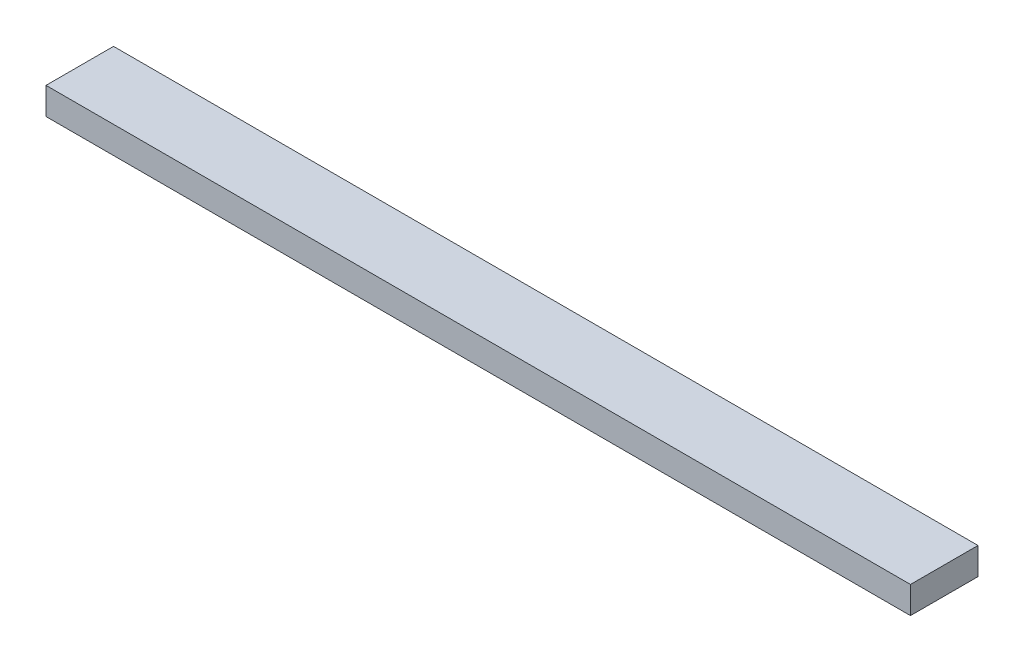
ISO-10303-21;
HEADER;
FILE_DESCRIPTION(('STEP AP214'),'2;1');
FILE_NAME('part.step','',(''),(''),'','','');
FILE_SCHEMA(('AUTOMOTIVE_DESIGN { 1 0 10303 214 1 1 1 1 }'));
ENDSEC;
DATA;
#1=APPLICATION_CONTEXT('core data for automotive mechanical design processes');
#2=APPLICATION_PROTOCOL_DEFINITION('international standard','automotive_design',2000,#1);
#3=PRODUCT_CONTEXT('',#1,'mechanical');
#4=PRODUCT('Part','Part','',(#3));
#5=PRODUCT_RELATED_PRODUCT_CATEGORY('part','',(#4));
#6=PRODUCT_DEFINITION_FORMATION('','',#4);
#7=PRODUCT_DEFINITION_CONTEXT('part definition',#1,'design');
#8=PRODUCT_DEFINITION('design','',#6,#7);
#9=PRODUCT_DEFINITION_SHAPE('','',#8);
#10=(LENGTH_UNIT() NAMED_UNIT(*) SI_UNIT(.MILLI.,.METRE.));
#11=(NAMED_UNIT(*) PLANE_ANGLE_UNIT() SI_UNIT($,.RADIAN.));
#12=(NAMED_UNIT(*) SI_UNIT($,.STERADIAN.) SOLID_ANGLE_UNIT());
#13=UNCERTAINTY_MEASURE_WITH_UNIT(LENGTH_MEASURE(1.E-05),#10,'distance_accuracy_value','');
#14=(GEOMETRIC_REPRESENTATION_CONTEXT(3) GLOBAL_UNCERTAINTY_ASSIGNED_CONTEXT((#13)) GLOBAL_UNIT_ASSIGNED_CONTEXT((#10,
#11,#12)) REPRESENTATION_CONTEXT('',''));
#15=CARTESIAN_POINT('',(0.,0.,0.));
#16=DIRECTION('',(0.,0.,1.));
#17=DIRECTION('',(1.,0.,0.));
#18=AXIS2_PLACEMENT_3D('',#15,#16,#17);
#19=CARTESIAN_POINT('',(0.,10.,0.));
#20=DIRECTION('',(1.,0.,0.));
#21=DIRECTION('',(0.,0.,-1.));
#22=AXIS2_PLACEMENT_3D('',#19,#20,#21);
#23=PLANE('',#22);
#24=DIRECTION('',(0.,0.,1.));
#25=VECTOR('',#24,1.);
#26=CARTESIAN_POINT('',(0.,0.,0.));
#27=LINE('',#26,#25);
#28=CARTESIAN_POINT('',(0.,0.,-25.));
#29=VERTEX_POINT('',#28);
#30=CARTESIAN_POINT('',(0.,0.,0.));
#31=VERTEX_POINT('',#30);
#32=EDGE_CURVE('E95',#29,#31,#27,.T.);
#33=ORIENTED_EDGE('',*,*,#32,.T.);
#34=DIRECTION('',(0.,-1.,0.));
#35=VECTOR('',#34,1.);
#36=CARTESIAN_POINT('',(0.,10.,0.));
#37=LINE('',#36,#35);
#38=CARTESIAN_POINT('',(0.,10.,0.));
#39=VERTEX_POINT('',#38);
#40=EDGE_CURVE('E11',#39,#31,#37,.T.);
#41=ORIENTED_EDGE('',*,*,#40,.F.);
#42=DIRECTION('',(0.,0.,1.));
#43=VECTOR('',#42,1.);
#44=CARTESIAN_POINT('',(0.,10.,0.));
#45=LINE('',#44,#43);
#46=CARTESIAN_POINT('',(0.,10.,-25.));
#47=VERTEX_POINT('',#46);
#48=EDGE_CURVE('E83',#47,#39,#45,.T.);
#49=ORIENTED_EDGE('',*,*,#48,.F.);
#50=DIRECTION('',(0.,-1.,0.));
#51=VECTOR('',#50,1.);
#52=CARTESIAN_POINT('',(0.,10.,-25.));
#53=LINE('',#52,#51);
#54=EDGE_CURVE('E91',#47,#29,#53,.T.);
#55=ORIENTED_EDGE('',*,*,#54,.T.);
#56=EDGE_LOOP('',(#33,#41,#49,#55));
#57=FACE_BOUND('',#56,.T.);
#58=ADVANCED_FACE('F32',(#57),#23,.F.);
#59=CARTESIAN_POINT('',(0.,10.,0.));
#60=DIRECTION('',(0.,0.,-1.));
#61=DIRECTION('',(-1.,0.,0.));
#62=AXIS2_PLACEMENT_3D('',#59,#60,#61);
#63=PLANE('',#62);
#64=DIRECTION('',(1.,0.,0.));
#65=VECTOR('',#64,1.);
#66=CARTESIAN_POINT('',(0.,0.,0.));
#67=LINE('',#66,#65);
#68=CARTESIAN_POINT('',(320.,0.,0.));
#69=VERTEX_POINT('',#68);
#70=EDGE_CURVE('E87',#31,#69,#67,.T.);
#71=ORIENTED_EDGE('',*,*,#70,.T.);
#72=DIRECTION('',(0.,-1.,0.));
#73=VECTOR('',#72,1.);
#74=CARTESIAN_POINT('',(320.,10.,0.));
#75=LINE('',#74,#73);
#76=CARTESIAN_POINT('',(320.,10.,0.));
#77=VERTEX_POINT('',#76);
#78=EDGE_CURVE('E40',#77,#69,#75,.T.);
#79=ORIENTED_EDGE('',*,*,#78,.F.);
#80=DIRECTION('',(1.,0.,0.));
#81=VECTOR('',#80,1.);
#82=CARTESIAN_POINT('',(0.,10.,0.));
#83=LINE('',#82,#81);
#84=EDGE_CURVE('E78',#39,#77,#83,.T.);
#85=ORIENTED_EDGE('',*,*,#84,.F.);
#86=ORIENTED_EDGE('',*,*,#40,.T.);
#87=EDGE_LOOP('',(#71,#79,#85,#86));
#88=FACE_BOUND('',#87,.T.);
#89=ADVANCED_FACE('F86',(#88),#63,.F.);
#90=CARTESIAN_POINT('',(320.,10.,0.));
#91=DIRECTION('',(-1.,0.,0.));
#92=DIRECTION('',(0.,0.,1.));
#93=AXIS2_PLACEMENT_3D('',#90,#91,#92);
#94=PLANE('',#93);
#95=DIRECTION('',(0.,0.,-1.));
#96=VECTOR('',#95,1.);
#97=CARTESIAN_POINT('',(320.,0.,0.));
#98=LINE('',#97,#96);
#99=CARTESIAN_POINT('',(320.,0.,-25.));
#100=VERTEX_POINT('',#99);
#101=EDGE_CURVE('E65',#69,#100,#98,.T.);
#102=ORIENTED_EDGE('',*,*,#101,.T.);
#103=DIRECTION('',(0.,-1.,0.));
#104=VECTOR('',#103,1.);
#105=CARTESIAN_POINT('',(320.,10.,-25.));
#106=LINE('',#105,#104);
#107=CARTESIAN_POINT('',(320.,10.,-25.));
#108=VERTEX_POINT('',#107);
#109=EDGE_CURVE('E88',#108,#100,#106,.T.);
#110=ORIENTED_EDGE('',*,*,#109,.F.);
#111=DIRECTION('',(0.,0.,-1.));
#112=VECTOR('',#111,1.);
#113=CARTESIAN_POINT('',(320.,10.,0.));
#114=LINE('',#113,#112);
#115=EDGE_CURVE('E81',#77,#108,#114,.T.);
#116=ORIENTED_EDGE('',*,*,#115,.F.);
#117=ORIENTED_EDGE('',*,*,#78,.T.);
#118=EDGE_LOOP('',(#102,#110,#116,#117));
#119=FACE_BOUND('',#118,.T.);
#120=ADVANCED_FACE('F89',(#119),#94,.F.);
#121=CARTESIAN_POINT('',(0.,10.,-25.));
#122=DIRECTION('',(0.,0.,1.));
#123=DIRECTION('',(1.,0.,0.));
#124=AXIS2_PLACEMENT_3D('',#121,#122,#123);
#125=PLANE('',#124);
#126=DIRECTION('',(-1.,0.,0.));
#127=VECTOR('',#126,1.);
#128=CARTESIAN_POINT('',(0.,0.,-25.));
#129=LINE('',#128,#127);
#130=EDGE_CURVE('E71',#100,#29,#129,.T.);
#131=ORIENTED_EDGE('',*,*,#130,.T.);
#132=ORIENTED_EDGE('',*,*,#54,.F.);
#133=DIRECTION('',(-1.,0.,0.));
#134=VECTOR('',#133,1.);
#135=CARTESIAN_POINT('',(0.,10.,-25.));
#136=LINE('',#135,#134);
#137=EDGE_CURVE('E48',#108,#47,#136,.T.);
#138=ORIENTED_EDGE('',*,*,#137,.F.);
#139=ORIENTED_EDGE('',*,*,#109,.T.);
#140=EDGE_LOOP('',(#131,#132,#138,#139));
#141=FACE_BOUND('',#140,.T.);
#142=ADVANCED_FACE('F102',(#141),#125,.F.);
#143=CARTESIAN_POINT('',(0.,10.,0.));
#144=DIRECTION('',(0.,-1.,0.));
#145=DIRECTION('',(0.,0.,-1.));
#146=AXIS2_PLACEMENT_3D('',#143,#144,#145);
#147=PLANE('',#146);
#148=ORIENTED_EDGE('',*,*,#48,.T.);
#149=ORIENTED_EDGE('',*,*,#84,.T.);
#150=ORIENTED_EDGE('',*,*,#115,.T.);
#151=ORIENTED_EDGE('',*,*,#137,.T.);
#152=EDGE_LOOP('',(#148,#149,#150,#151));
#153=FACE_BOUND('',#152,.T.);
#154=ADVANCED_FACE('F79',(#153),#147,.F.);
#155=CARTESIAN_POINT('',(0.,0.,0.));
#156=DIRECTION('',(0.,-1.,0.));
#157=DIRECTION('',(0.,0.,-1.));
#158=AXIS2_PLACEMENT_3D('',#155,#156,#157);
#159=PLANE('',#158);
#160=ORIENTED_EDGE('',*,*,#32,.F.);
#161=ORIENTED_EDGE('',*,*,#130,.F.);
#162=ORIENTED_EDGE('',*,*,#101,.F.);
#163=ORIENTED_EDGE('',*,*,#70,.F.);
#164=EDGE_LOOP('',(#160,#161,#162,#163));
#165=FACE_BOUND('',#164,.T.);
#166=ADVANCED_FACE('F105',(#165),#159,.T.);
#167=CLOSED_SHELL('',(#58,#89,#120,#142,#154,#166));
#168=MANIFOLD_SOLID_BREP('B2',#167);
#169=ADVANCED_BREP_SHAPE_REPRESENTATION('',(#18,#168),#14);
#170=SHAPE_DEFINITION_REPRESENTATION(#9,#169);
ENDSEC;
END-ISO-10303-21;
